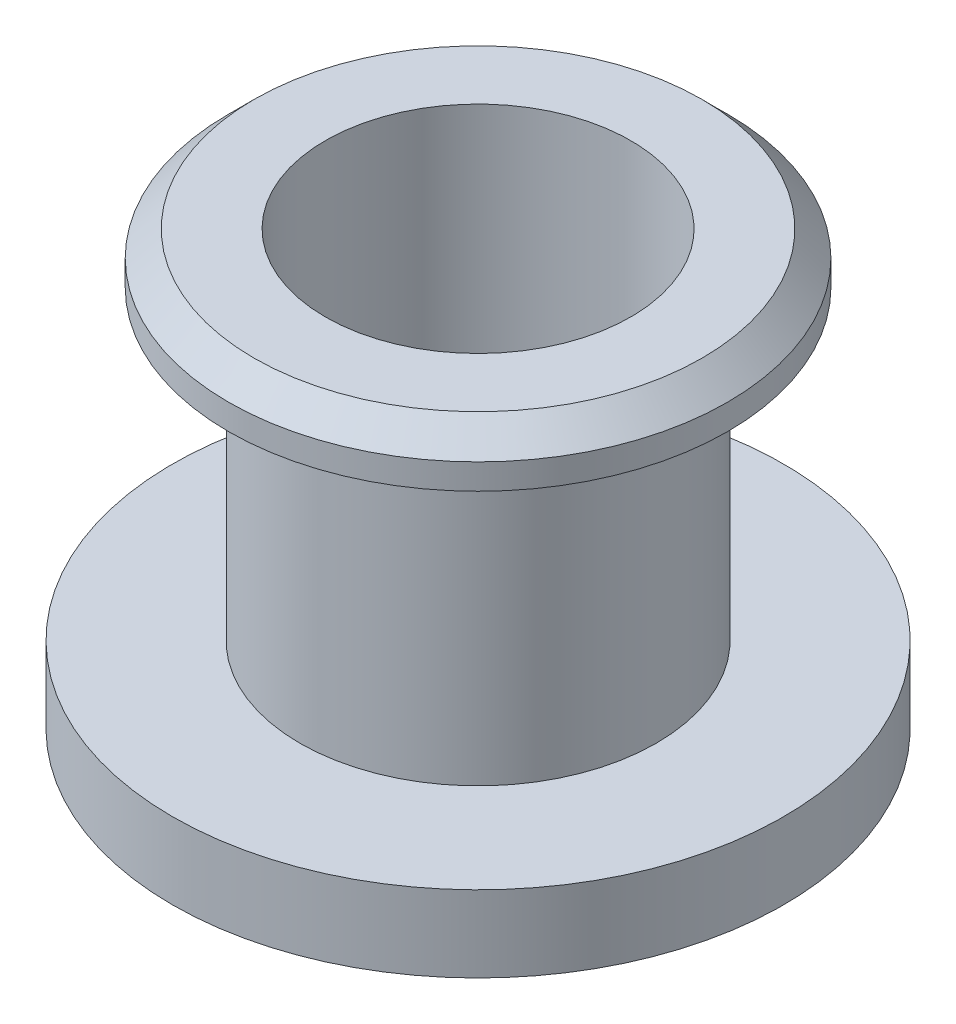
ISO-10303-21;
HEADER;
FILE_DESCRIPTION(('STEP AP214'),'2;1');
FILE_NAME('part.step','',(''),(''),'','','');
FILE_SCHEMA(('AUTOMOTIVE_DESIGN { 1 0 10303 214 1 1 1 1 }'));
ENDSEC;
DATA;
#1=APPLICATION_CONTEXT('core data for automotive mechanical design processes');
#2=APPLICATION_PROTOCOL_DEFINITION('international standard','automotive_design',2000,#1);
#3=PRODUCT_CONTEXT('',#1,'mechanical');
#4=PRODUCT('Part','Part','',(#3));
#5=PRODUCT_RELATED_PRODUCT_CATEGORY('part','',(#4));
#6=PRODUCT_DEFINITION_FORMATION('','',#4);
#7=PRODUCT_DEFINITION_CONTEXT('part definition',#1,'design');
#8=PRODUCT_DEFINITION('design','',#6,#7);
#9=PRODUCT_DEFINITION_SHAPE('','',#8);
#10=(LENGTH_UNIT() NAMED_UNIT(*) SI_UNIT(.MILLI.,.METRE.));
#11=(NAMED_UNIT(*) PLANE_ANGLE_UNIT() SI_UNIT($,.RADIAN.));
#12=(NAMED_UNIT(*) SI_UNIT($,.STERADIAN.) SOLID_ANGLE_UNIT());
#13=UNCERTAINTY_MEASURE_WITH_UNIT(LENGTH_MEASURE(1.E-05),#10,'distance_accuracy_value','');
#14=(GEOMETRIC_REPRESENTATION_CONTEXT(3) GLOBAL_UNCERTAINTY_ASSIGNED_CONTEXT((#13)) GLOBAL_UNIT_ASSIGNED_CONTEXT((#10,
#11,#12)) REPRESENTATION_CONTEXT('',''));
#15=CARTESIAN_POINT('',(0.,0.,0.));
#16=DIRECTION('',(0.,0.,1.));
#17=DIRECTION('',(1.,0.,0.));
#18=AXIS2_PLACEMENT_3D('',#15,#16,#17);
#19=CARTESIAN_POINT('',(0.,-1.5,0.));
#20=DIRECTION('',(0.,1.,0.));
#21=DIRECTION('',(0.,0.,1.));
#22=AXIS2_PLACEMENT_3D('',#19,#20,#21);
#23=PLANE('',#22);
#24=CARTESIAN_POINT('',(0.,-1.5,0.));
#25=DIRECTION('',(0.,1.,0.));
#26=DIRECTION('',(0.,0.,1.));
#27=AXIS2_PLACEMENT_3D('',#24,#25,#26);
#28=CIRCLE('',#27,6.);
#29=CARTESIAN_POINT('',(0.,-1.5,6.));
#30=VERTEX_POINT('',#29);
#31=EDGE_CURVE('E46',#30,#30,#28,.T.);
#32=ORIENTED_EDGE('',*,*,#31,.F.);
#33=EDGE_LOOP('',(#32));
#34=FACE_BOUND('',#33,.T.);
#35=CARTESIAN_POINT('',(0.,-1.5,0.));
#36=DIRECTION('',(0.,1.,0.));
#37=DIRECTION('',(0.,0.,1.));
#38=AXIS2_PLACEMENT_3D('',#35,#36,#37);
#39=CIRCLE('',#38,3.);
#40=CARTESIAN_POINT('',(0.,-1.5,3.));
#41=VERTEX_POINT('',#40);
#42=EDGE_CURVE('E52',#41,#41,#39,.T.);
#43=ORIENTED_EDGE('',*,*,#42,.T.);
#44=EDGE_LOOP('',(#43));
#45=FACE_BOUND('',#44,.T.);
#46=ADVANCED_FACE('F31',(#34,#45),#23,.F.);
#47=CARTESIAN_POINT('',(0.,-1.5,0.));
#48=DIRECTION('',(0.,1.,0.));
#49=DIRECTION('',(0.,0.,1.));
#50=AXIS2_PLACEMENT_3D('',#47,#48,#49);
#51=CYLINDRICAL_SURFACE('',#50,6.);
#52=ORIENTED_EDGE('',*,*,#31,.T.);
#53=EDGE_LOOP('',(#52));
#54=FACE_BOUND('',#53,.T.);
#55=CARTESIAN_POINT('',(0.,0.,0.));
#56=DIRECTION('',(0.,1.,0.));
#57=DIRECTION('',(0.,0.,1.));
#58=AXIS2_PLACEMENT_3D('',#55,#56,#57);
#59=CIRCLE('',#58,6.);
#60=CARTESIAN_POINT('',(0.,0.,6.));
#61=VERTEX_POINT('',#60);
#62=EDGE_CURVE('E49',#61,#61,#59,.T.);
#63=ORIENTED_EDGE('',*,*,#62,.F.);
#64=EDGE_LOOP('',(#63));
#65=FACE_BOUND('',#64,.T.);
#66=ADVANCED_FACE('F84',(#54,#65),#51,.T.);
#67=CARTESIAN_POINT('',(0.,0.,0.));
#68=DIRECTION('',(0.,1.,0.));
#69=DIRECTION('',(0.,0.,1.));
#70=AXIS2_PLACEMENT_3D('',#67,#68,#69);
#71=PLANE('',#70);
#72=CARTESIAN_POINT('',(0.,0.,0.));
#73=DIRECTION('',(0.,1.,0.));
#74=DIRECTION('',(0.,0.,1.));
#75=AXIS2_PLACEMENT_3D('',#72,#73,#74);
#76=CIRCLE('',#75,3.5);
#77=CARTESIAN_POINT('',(0.,0.,3.5));
#78=VERTEX_POINT('',#77);
#79=EDGE_CURVE('E42',#78,#78,#76,.T.);
#80=ORIENTED_EDGE('',*,*,#79,.F.);
#81=EDGE_LOOP('',(#80));
#82=FACE_BOUND('',#81,.T.);
#83=ORIENTED_EDGE('',*,*,#62,.T.);
#84=EDGE_LOOP('',(#83));
#85=FACE_BOUND('',#84,.T.);
#86=ADVANCED_FACE('F90',(#82,#85),#71,.T.);
#87=CARTESIAN_POINT('',(0.,6.,0.));
#88=DIRECTION('',(0.,-1.,0.));
#89=DIRECTION('',(0.,0.,-1.));
#90=AXIS2_PLACEMENT_3D('',#87,#88,#89);
#91=CYLINDRICAL_SURFACE('',#90,3.5);
#92=CARTESIAN_POINT('',(0.,6.,0.));
#93=DIRECTION('',(0.,-1.,0.));
#94=DIRECTION('',(0.,0.,-1.));
#95=AXIS2_PLACEMENT_3D('',#92,#93,#94);
#96=CIRCLE('',#95,3.5);
#97=CARTESIAN_POINT('',(0.,6.,-3.5));
#98=VERTEX_POINT('',#97);
#99=EDGE_CURVE('E55',#98,#98,#96,.T.);
#100=ORIENTED_EDGE('',*,*,#99,.T.);
#101=EDGE_LOOP('',(#100));
#102=FACE_BOUND('',#101,.T.);
#103=ORIENTED_EDGE('',*,*,#79,.T.);
#104=EDGE_LOOP('',(#103));
#105=FACE_BOUND('',#104,.T.);
#106=ADVANCED_FACE('F80',(#102,#105),#91,.T.);
#107=CARTESIAN_POINT('',(0.,6.,0.));
#108=DIRECTION('',(0.,-1.,0.));
#109=DIRECTION('',(0.,0.,-1.));
#110=AXIS2_PLACEMENT_3D('',#107,#108,#109);
#111=CYLINDRICAL_SURFACE('',#110,3.);
#112=ORIENTED_EDGE('',*,*,#42,.F.);
#113=EDGE_LOOP('',(#112));
#114=FACE_BOUND('',#113,.T.);
#115=CARTESIAN_POINT('',(0.,7.,0.));
#116=DIRECTION('',(0.,1.,0.));
#117=DIRECTION('',(0.,0.,1.));
#118=AXIS2_PLACEMENT_3D('',#115,#116,#117);
#119=CIRCLE('',#118,3.);
#120=CARTESIAN_POINT('',(0.,7.,3.));
#121=VERTEX_POINT('',#120);
#122=EDGE_CURVE('E63',#121,#121,#119,.T.);
#123=ORIENTED_EDGE('',*,*,#122,.T.);
#124=EDGE_LOOP('',(#123));
#125=FACE_BOUND('',#124,.T.);
#126=ADVANCED_FACE('F67',(#114,#125),#111,.F.);
#127=CARTESIAN_POINT('',(0.,7.,0.));
#128=DIRECTION('',(0.,1.,0.));
#129=DIRECTION('',(0.,0.,1.));
#130=AXIS2_PLACEMENT_3D('',#127,#128,#129);
#131=PLANE('',#130);
#132=CARTESIAN_POINT('',(0.,7.,0.));
#133=DIRECTION('',(0.,1.,0.));
#134=DIRECTION('',(0.,0.,1.));
#135=AXIS2_PLACEMENT_3D('',#132,#133,#134);
#136=CIRCLE('',#135,4.40000000000001);
#137=CARTESIAN_POINT('',(0.,7.,4.40000000000001));
#138=VERTEX_POINT('',#137);
#139=EDGE_CURVE('E38',#138,#138,#136,.T.);
#140=ORIENTED_EDGE('',*,*,#139,.T.);
#141=EDGE_LOOP('',(#140));
#142=FACE_BOUND('',#141,.T.);
#143=ORIENTED_EDGE('',*,*,#122,.F.);
#144=EDGE_LOOP('',(#143));
#145=FACE_BOUND('',#144,.T.);
#146=ADVANCED_FACE('F69',(#142,#145),#131,.T.);
#147=CARTESIAN_POINT('',(0.,6.,0.));
#148=DIRECTION('',(0.,1.,0.));
#149=DIRECTION('',(0.,0.,1.));
#150=AXIS2_PLACEMENT_3D('',#147,#148,#149);
#151=PLANE('',#150);
#152=ORIENTED_EDGE('',*,*,#99,.F.);
#153=EDGE_LOOP('',(#152));
#154=FACE_BOUND('',#153,.T.);
#155=CARTESIAN_POINT('',(0.,6.,0.));
#156=DIRECTION('',(0.,1.,0.));
#157=DIRECTION('',(0.,0.,1.));
#158=AXIS2_PLACEMENT_3D('',#155,#156,#157);
#159=CIRCLE('',#158,4.9);
#160=CARTESIAN_POINT('',(0.,6.,4.9));
#161=VERTEX_POINT('',#160);
#162=EDGE_CURVE('E58',#161,#161,#159,.T.);
#163=ORIENTED_EDGE('',*,*,#162,.F.);
#164=EDGE_LOOP('',(#163));
#165=FACE_BOUND('',#164,.T.);
#166=ADVANCED_FACE('F71',(#154,#165),#151,.F.);
#167=CARTESIAN_POINT('',(0.,7.,0.));
#168=DIRECTION('',(0.,-1.,0.));
#169=DIRECTION('',(0.,0.,-1.));
#170=AXIS2_PLACEMENT_3D('',#167,#168,#169);
#171=CYLINDRICAL_SURFACE('',#170,4.9);
#172=CARTESIAN_POINT('',(0.,6.5,0.));
#173=DIRECTION('',(0.,1.,0.));
#174=DIRECTION('',(0.,0.,1.));
#175=AXIS2_PLACEMENT_3D('',#172,#173,#174);
#176=CIRCLE('',#175,4.9);
#177=CARTESIAN_POINT('',(0.,6.5,4.9));
#178=VERTEX_POINT('',#177);
#179=EDGE_CURVE('E10',#178,#178,#176,.F.);
#180=ORIENTED_EDGE('',*,*,#179,.T.);
#181=EDGE_LOOP('',(#180));
#182=FACE_BOUND('',#181,.T.);
#183=ORIENTED_EDGE('',*,*,#162,.T.);
#184=EDGE_LOOP('',(#183));
#185=FACE_BOUND('',#184,.T.);
#186=ADVANCED_FACE('F77',(#182,#185),#171,.T.);
#187=CARTESIAN_POINT('',(0.,7.,0.));
#188=DIRECTION('',(0.,-1.,0.));
#189=DIRECTION('',(0.,0.,-1.));
#190=AXIS2_PLACEMENT_3D('',#187,#188,#189);
#191=CONICAL_SURFACE('',#190,4.40000000000001,0.785398163397445);
#192=ORIENTED_EDGE('',*,*,#179,.F.);
#193=EDGE_LOOP('',(#192));
#194=FACE_BOUND('',#193,.T.);
#195=ORIENTED_EDGE('',*,*,#139,.F.);
#196=EDGE_LOOP('',(#195));
#197=FACE_BOUND('',#196,.T.);
#198=ADVANCED_FACE('F33',(#194,#197),#191,.T.);
#199=CLOSED_SHELL('',(#46,#66,#86,#106,#126,#146,#166,#186,#198));
#200=MANIFOLD_SOLID_BREP('B2',#199);
#201=ADVANCED_BREP_SHAPE_REPRESENTATION('',(#18,#200),#14);
#202=SHAPE_DEFINITION_REPRESENTATION(#9,#201);
ENDSEC;
END-ISO-10303-21;
